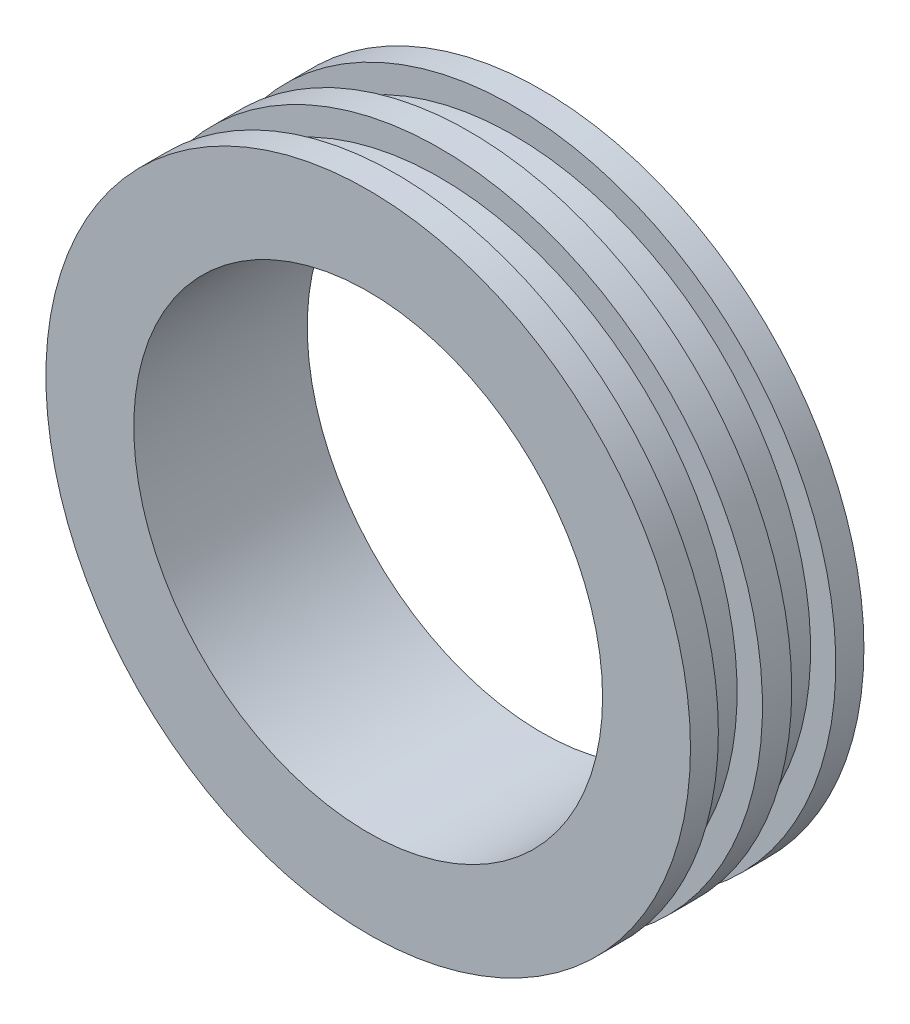
ISO-10303-21;
HEADER;
FILE_DESCRIPTION(('STEP AP214'),'2;1');
FILE_NAME('part.step','',(''),(''),'','','');
FILE_SCHEMA(('AUTOMOTIVE_DESIGN { 1 0 10303 214 1 1 1 1 }'));
ENDSEC;
DATA;
#1=APPLICATION_CONTEXT('core data for automotive mechanical design processes');
#2=APPLICATION_PROTOCOL_DEFINITION('international standard','automotive_design',2000,#1);
#3=PRODUCT_CONTEXT('',#1,'mechanical');
#4=PRODUCT('Part','Part','',(#3));
#5=PRODUCT_RELATED_PRODUCT_CATEGORY('part','',(#4));
#6=PRODUCT_DEFINITION_FORMATION('','',#4);
#7=PRODUCT_DEFINITION_CONTEXT('part definition',#1,'design');
#8=PRODUCT_DEFINITION('design','',#6,#7);
#9=PRODUCT_DEFINITION_SHAPE('','',#8);
#10=(LENGTH_UNIT() NAMED_UNIT(*) SI_UNIT(.MILLI.,.METRE.));
#11=(NAMED_UNIT(*) PLANE_ANGLE_UNIT() SI_UNIT($,.RADIAN.));
#12=(NAMED_UNIT(*) SI_UNIT($,.STERADIAN.) SOLID_ANGLE_UNIT());
#13=UNCERTAINTY_MEASURE_WITH_UNIT(LENGTH_MEASURE(1.E-05),#10,'distance_accuracy_value','');
#14=(GEOMETRIC_REPRESENTATION_CONTEXT(3) GLOBAL_UNCERTAINTY_ASSIGNED_CONTEXT((#13)) GLOBAL_UNIT_ASSIGNED_CONTEXT((#10,
#11,#12)) REPRESENTATION_CONTEXT('',''));
#15=CARTESIAN_POINT('',(0.,0.,0.));
#16=DIRECTION('',(0.,0.,1.));
#17=DIRECTION('',(1.,0.,0.));
#18=AXIS2_PLACEMENT_3D('',#15,#16,#17);
#19=CARTESIAN_POINT('',(0.,0.,18.796));
#20=DIRECTION('',(0.,0.,-1.));
#21=DIRECTION('',(-1.,0.,0.));
#22=AXIS2_PLACEMENT_3D('',#19,#20,#21);
#23=CYLINDRICAL_SURFACE('',#22,34.925);
#24=CARTESIAN_POINT('',(0.,0.,15.7734));
#25=DIRECTION('',(0.,0.,1.));
#26=DIRECTION('',(1.,0.,0.));
#27=AXIS2_PLACEMENT_3D('',#24,#25,#26);
#28=CIRCLE('',#27,34.925);
#29=CARTESIAN_POINT('',(34.925,0.,15.7734));
#30=VERTEX_POINT('',#29);
#31=EDGE_CURVE('E37',#30,#30,#28,.T.);
#32=ORIENTED_EDGE('',*,*,#31,.T.);
#33=EDGE_LOOP('',(#32));
#34=FACE_BOUND('',#33,.T.);
#35=CARTESIAN_POINT('',(0.,0.,18.796));
#36=DIRECTION('',(0.,0.,1.));
#37=DIRECTION('',(1.,0.,0.));
#38=AXIS2_PLACEMENT_3D('',#35,#36,#37);
#39=CIRCLE('',#38,34.925);
#40=CARTESIAN_POINT('',(34.925,0.,18.796));
#41=VERTEX_POINT('',#40);
#42=EDGE_CURVE('E10',#41,#41,#39,.T.);
#43=ORIENTED_EDGE('',*,*,#42,.F.);
#44=EDGE_LOOP('',(#43));
#45=FACE_BOUND('',#44,.T.);
#46=ADVANCED_FACE('F33',(#34,#45),#23,.T.);
#47=CARTESIAN_POINT('',(0.,0.,18.796));
#48=DIRECTION('',(0.,0.,1.));
#49=DIRECTION('',(1.,0.,0.));
#50=AXIS2_PLACEMENT_3D('',#47,#48,#49);
#51=PLANE('',#50);
#52=ORIENTED_EDGE('',*,*,#42,.T.);
#53=EDGE_LOOP('',(#52));
#54=FACE_BOUND('',#53,.T.);
#55=CARTESIAN_POINT('',(0.,0.,18.796));
#56=DIRECTION('',(0.,0.,1.));
#57=DIRECTION('',(1.,0.,0.));
#58=AXIS2_PLACEMENT_3D('',#55,#56,#57);
#59=CIRCLE('',#58,25.4);
#60=CARTESIAN_POINT('',(25.4,0.,18.796));
#61=VERTEX_POINT('',#60);
#62=EDGE_CURVE('E46',#61,#61,#59,.T.);
#63=ORIENTED_EDGE('',*,*,#62,.F.);
#64=EDGE_LOOP('',(#63));
#65=FACE_BOUND('',#64,.T.);
#66=ADVANCED_FACE('F115',(#54,#65),#51,.T.);
#67=CARTESIAN_POINT('',(0.,0.,0.));
#68=DIRECTION('',(0.,0.,1.));
#69=DIRECTION('',(1.,0.,0.));
#70=AXIS2_PLACEMENT_3D('',#67,#68,#69);
#71=PLANE('',#70);
#72=CARTESIAN_POINT('',(0.,0.,0.));
#73=DIRECTION('',(0.,0.,1.));
#74=DIRECTION('',(1.,0.,0.));
#75=AXIS2_PLACEMENT_3D('',#72,#73,#74);
#76=CIRCLE('',#75,34.925);
#77=CARTESIAN_POINT('',(34.925,0.,0.));
#78=VERTEX_POINT('',#77);
#79=EDGE_CURVE('E41',#78,#78,#76,.T.);
#80=ORIENTED_EDGE('',*,*,#79,.F.);
#81=EDGE_LOOP('',(#80));
#82=FACE_BOUND('',#81,.T.);
#83=CARTESIAN_POINT('',(0.,0.,0.));
#84=DIRECTION('',(0.,0.,1.));
#85=DIRECTION('',(1.,0.,0.));
#86=AXIS2_PLACEMENT_3D('',#83,#84,#85);
#87=CIRCLE('',#86,25.4);
#88=CARTESIAN_POINT('',(25.4,0.,0.));
#89=VERTEX_POINT('',#88);
#90=EDGE_CURVE('E49',#89,#89,#87,.T.);
#91=ORIENTED_EDGE('',*,*,#90,.T.);
#92=EDGE_LOOP('',(#91));
#93=FACE_BOUND('',#92,.T.);
#94=ADVANCED_FACE('F112',(#82,#93),#71,.F.);
#95=CARTESIAN_POINT('',(0.,0.,3.048));
#96=DIRECTION('',(0.,0.,-1.));
#97=DIRECTION('',(-1.,0.,0.));
#98=AXIS2_PLACEMENT_3D('',#95,#96,#97);
#99=CIRCLE('',#98,34.925);
#100=CARTESIAN_POINT('',(-34.925,0.,3.048));
#101=VERTEX_POINT('',#100);
#102=EDGE_CURVE('E52',#101,#101,#99,.T.);
#103=ORIENTED_EDGE('',*,*,#102,.T.);
#104=EDGE_LOOP('',(#103));
#105=FACE_BOUND('',#104,.T.);
#106=ORIENTED_EDGE('',*,*,#79,.T.);
#107=EDGE_LOOP('',(#106));
#108=FACE_BOUND('',#107,.T.);
#109=ADVANCED_FACE('F35',(#105,#108),#23,.T.);
#110=CARTESIAN_POINT('',(0.,0.,18.796));
#111=DIRECTION('',(0.,0.,-1.));
#112=DIRECTION('',(-1.,0.,0.));
#113=AXIS2_PLACEMENT_3D('',#110,#111,#112);
#114=CYLINDRICAL_SURFACE('',#113,25.4);
#115=ORIENTED_EDGE('',*,*,#62,.T.);
#116=EDGE_LOOP('',(#115));
#117=FACE_BOUND('',#116,.T.);
#118=ORIENTED_EDGE('',*,*,#90,.F.);
#119=EDGE_LOOP('',(#118));
#120=FACE_BOUND('',#119,.T.);
#121=ADVANCED_FACE('F96',(#117,#120),#114,.F.);
#122=CARTESIAN_POINT('',(0.,34.9875950959415,7.8232));
#123=DIRECTION('',(0.,0.,1.));
#124=DIRECTION('',(1.,0.,0.));
#125=AXIS2_PLACEMENT_3D('',#122,#123,#124);
#126=PLANE('',#125);
#127=CARTESIAN_POINT('',(0.,0.,7.8232));
#128=DIRECTION('',(0.,0.,-1.));
#129=DIRECTION('',(-1.,0.,0.));
#130=AXIS2_PLACEMENT_3D('',#127,#128,#129);
#131=CIRCLE('',#130,32.1935950959415);
#132=CARTESIAN_POINT('',(-32.1935950959415,0.,7.8232));
#133=VERTEX_POINT('',#132);
#134=EDGE_CURVE('E77',#133,#133,#131,.T.);
#135=ORIENTED_EDGE('',*,*,#134,.F.);
#136=EDGE_LOOP('',(#135));
#137=FACE_BOUND('',#136,.T.);
#138=CARTESIAN_POINT('',(0.,0.,7.8232));
#139=DIRECTION('',(0.,0.,1.));
#140=DIRECTION('',(1.,0.,0.));
#141=AXIS2_PLACEMENT_3D('',#138,#139,#140);
#142=CIRCLE('',#141,34.925);
#143=CARTESIAN_POINT('',(34.925,0.,7.8232));
#144=VERTEX_POINT('',#143);
#145=EDGE_CURVE('E55',#144,#144,#142,.T.);
#146=ORIENTED_EDGE('',*,*,#145,.F.);
#147=EDGE_LOOP('',(#146));
#148=FACE_BOUND('',#147,.T.);
#149=ADVANCED_FACE('F90',(#137,#148),#126,.F.);
#150=CARTESIAN_POINT('',(0.,0.,11.0109));
#151=DIRECTION('',(0.,0.,-1.));
#152=DIRECTION('',(-1.,0.,0.));
#153=AXIS2_PLACEMENT_3D('',#150,#151,#152);
#154=CYLINDRICAL_SURFACE('',#153,32.1935950959415);
#155=CARTESIAN_POINT('',(0.,0.,3.048));
#156=DIRECTION('',(0.,0.,-1.));
#157=DIRECTION('',(-1.,0.,0.));
#158=AXIS2_PLACEMENT_3D('',#155,#156,#157);
#159=CIRCLE('',#158,32.1935950959415);
#160=CARTESIAN_POINT('',(-32.1935950959415,0.,3.048));
#161=VERTEX_POINT('',#160);
#162=EDGE_CURVE('E80',#161,#161,#159,.T.);
#163=ORIENTED_EDGE('',*,*,#162,.F.);
#164=EDGE_LOOP('',(#163));
#165=FACE_BOUND('',#164,.T.);
#166=ORIENTED_EDGE('',*,*,#134,.T.);
#167=EDGE_LOOP('',(#166));
#168=FACE_BOUND('',#167,.T.);
#169=ADVANCED_FACE('F87',(#165,#168),#154,.T.);
#170=CARTESIAN_POINT('',(0.,38.1258394061774,3.048));
#171=DIRECTION('',(0.,0.,-1.));
#172=DIRECTION('',(-1.,0.,0.));
#173=AXIS2_PLACEMENT_3D('',#170,#171,#172);
#174=PLANE('',#173);
#175=ORIENTED_EDGE('',*,*,#162,.T.);
#176=EDGE_LOOP('',(#175));
#177=FACE_BOUND('',#176,.T.);
#178=ORIENTED_EDGE('',*,*,#102,.F.);
#179=EDGE_LOOP('',(#178));
#180=FACE_BOUND('',#179,.T.);
#181=ADVANCED_FACE('F84',(#177,#180),#174,.F.);
#182=CARTESIAN_POINT('',(0.,0.,10.9984845231634));
#183=DIRECTION('',(0.,0.,-1.));
#184=DIRECTION('',(-1.,0.,0.));
#185=AXIS2_PLACEMENT_3D('',#182,#183,#184);
#186=CIRCLE('',#185,34.925);
#187=CARTESIAN_POINT('',(-34.925,0.,10.9984845231634));
#188=VERTEX_POINT('',#187);
#189=EDGE_CURVE('E58',#188,#188,#186,.T.);
#190=ORIENTED_EDGE('',*,*,#189,.T.);
#191=EDGE_LOOP('',(#190));
#192=FACE_BOUND('',#191,.T.);
#193=ORIENTED_EDGE('',*,*,#145,.T.);
#194=EDGE_LOOP('',(#193));
#195=FACE_BOUND('',#194,.T.);
#196=ADVANCED_FACE('F100',(#192,#195),#23,.T.);
#197=CARTESIAN_POINT('',(0.,34.9875950959415,15.7734));
#198=DIRECTION('',(0.,0.,1.));
#199=DIRECTION('',(1.,0.,0.));
#200=AXIS2_PLACEMENT_3D('',#197,#198,#199);
#201=PLANE('',#200);
#202=CARTESIAN_POINT('',(0.,0.,15.7734));
#203=DIRECTION('',(0.,0.,-1.));
#204=DIRECTION('',(-1.,0.,0.));
#205=AXIS2_PLACEMENT_3D('',#202,#203,#204);
#206=CIRCLE('',#205,32.1935950959415);
#207=CARTESIAN_POINT('',(-32.1935950959415,0.,15.7734));
#208=VERTEX_POINT('',#207);
#209=EDGE_CURVE('E56',#208,#208,#206,.T.);
#210=ORIENTED_EDGE('',*,*,#209,.F.);
#211=EDGE_LOOP('',(#210));
#212=FACE_BOUND('',#211,.T.);
#213=ORIENTED_EDGE('',*,*,#31,.F.);
#214=EDGE_LOOP('',(#213));
#215=FACE_BOUND('',#214,.T.);
#216=ADVANCED_FACE('F102',(#212,#215),#201,.F.);
#217=CARTESIAN_POINT('',(0.,0.,11.0109));
#218=DIRECTION('',(0.,0.,-1.));
#219=DIRECTION('',(-1.,0.,0.));
#220=AXIS2_PLACEMENT_3D('',#217,#218,#219);
#221=CONICAL_SURFACE('',#220,32.1935950959415,1.56625090355384);
#222=CARTESIAN_POINT('',(0.,0.,11.0109));
#223=DIRECTION('',(0.,0.,-1.));
#224=DIRECTION('',(-1.,0.,0.));
#225=AXIS2_PLACEMENT_3D('',#222,#223,#224);
#226=CIRCLE('',#225,32.1935950959415);
#227=CARTESIAN_POINT('',(-32.1935950959415,0.,11.0109));
#228=VERTEX_POINT('',#227);
#229=EDGE_CURVE('E74',#228,#228,#226,.T.);
#230=ORIENTED_EDGE('',*,*,#229,.T.);
#231=EDGE_LOOP('',(#230));
#232=FACE_BOUND('',#231,.T.);
#233=ORIENTED_EDGE('',*,*,#189,.F.);
#234=EDGE_LOOP('',(#233));
#235=FACE_BOUND('',#234,.T.);
#236=ADVANCED_FACE('F107',(#232,#235),#221,.T.);
#237=CARTESIAN_POINT('',(0.,0.,11.0109));
#238=DIRECTION('',(0.,0.,-1.));
#239=DIRECTION('',(-1.,0.,0.));
#240=AXIS2_PLACEMENT_3D('',#237,#238,#239);
#241=CYLINDRICAL_SURFACE('',#240,32.1935950959415);
#242=ORIENTED_EDGE('',*,*,#229,.F.);
#243=EDGE_LOOP('',(#242));
#244=FACE_BOUND('',#243,.T.);
#245=ORIENTED_EDGE('',*,*,#209,.T.);
#246=EDGE_LOOP('',(#245));
#247=FACE_BOUND('',#246,.T.);
#248=ADVANCED_FACE('F129',(#244,#247),#241,.T.);
#249=CLOSED_SHELL('',(#46,#66,#94,#109,#121,#149,#169,#181,#196,#216,#236,#248));
#250=MANIFOLD_SOLID_BREP('B2',#249);
#251=ADVANCED_BREP_SHAPE_REPRESENTATION('',(#18,#250),#14);
#252=SHAPE_DEFINITION_REPRESENTATION(#9,#251);
ENDSEC;
END-ISO-10303-21;
